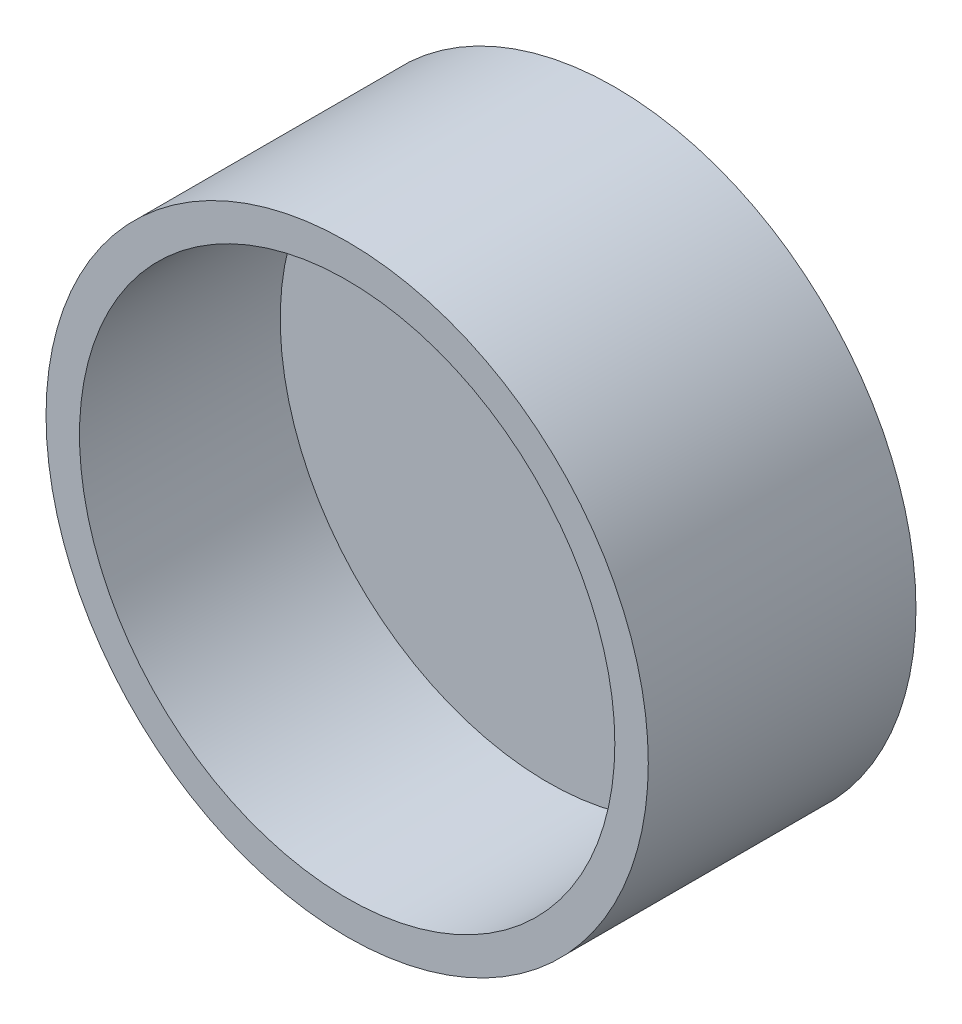
ISO-10303-21;
HEADER;
FILE_DESCRIPTION(('STEP AP214'),'2;1');
FILE_NAME('part.step','',(''),(''),'','','');
FILE_SCHEMA(('AUTOMOTIVE_DESIGN { 1 0 10303 214 1 1 1 1 }'));
ENDSEC;
DATA;
#1=APPLICATION_CONTEXT('core data for automotive mechanical design processes');
#2=APPLICATION_PROTOCOL_DEFINITION('international standard','automotive_design',2000,#1);
#3=PRODUCT_CONTEXT('',#1,'mechanical');
#4=PRODUCT('Part','Part','',(#3));
#5=PRODUCT_RELATED_PRODUCT_CATEGORY('part','',(#4));
#6=PRODUCT_DEFINITION_FORMATION('','',#4);
#7=PRODUCT_DEFINITION_CONTEXT('part definition',#1,'design');
#8=PRODUCT_DEFINITION('design','',#6,#7);
#9=PRODUCT_DEFINITION_SHAPE('','',#8);
#10=(LENGTH_UNIT() NAMED_UNIT(*) SI_UNIT(.MILLI.,.METRE.));
#11=(NAMED_UNIT(*) PLANE_ANGLE_UNIT() SI_UNIT($,.RADIAN.));
#12=(NAMED_UNIT(*) SI_UNIT($,.STERADIAN.) SOLID_ANGLE_UNIT());
#13=UNCERTAINTY_MEASURE_WITH_UNIT(LENGTH_MEASURE(1.E-05),#10,'distance_accuracy_value','');
#14=(GEOMETRIC_REPRESENTATION_CONTEXT(3) GLOBAL_UNCERTAINTY_ASSIGNED_CONTEXT((#13)) GLOBAL_UNIT_ASSIGNED_CONTEXT((#10,
#11,#12)) REPRESENTATION_CONTEXT('',''));
#15=CARTESIAN_POINT('',(0.,0.,0.));
#16=DIRECTION('',(0.,0.,1.));
#17=DIRECTION('',(1.,0.,0.));
#18=AXIS2_PLACEMENT_3D('',#15,#16,#17);
#19=CARTESIAN_POINT('',(0.,0.,20.));
#20=DIRECTION('',(0.,0.,-1.));
#21=DIRECTION('',(-1.,0.,0.));
#22=AXIS2_PLACEMENT_3D('',#19,#20,#21);
#23=CYLINDRICAL_SURFACE('',#22,22.5);
#24=CARTESIAN_POINT('',(0.,0.,20.));
#25=DIRECTION('',(0.,0.,1.));
#26=DIRECTION('',(1.,0.,0.));
#27=AXIS2_PLACEMENT_3D('',#24,#25,#26);
#28=CIRCLE('',#27,22.5);
#29=CARTESIAN_POINT('',(22.5,0.,20.));
#30=VERTEX_POINT('',#29);
#31=EDGE_CURVE('E10',#30,#30,#28,.T.);
#32=ORIENTED_EDGE('',*,*,#31,.F.);
#33=EDGE_LOOP('',(#32));
#34=FACE_BOUND('',#33,.T.);
#35=CARTESIAN_POINT('',(0.,0.,0.));
#36=DIRECTION('',(0.,0.,1.));
#37=DIRECTION('',(1.,0.,0.));
#38=AXIS2_PLACEMENT_3D('',#35,#36,#37);
#39=CIRCLE('',#38,22.5);
#40=CARTESIAN_POINT('',(22.5,0.,0.));
#41=VERTEX_POINT('',#40);
#42=EDGE_CURVE('E40',#41,#41,#39,.T.);
#43=ORIENTED_EDGE('',*,*,#42,.T.);
#44=EDGE_LOOP('',(#43));
#45=FACE_BOUND('',#44,.T.);
#46=ADVANCED_FACE('F37',(#34,#45),#23,.T.);
#47=CARTESIAN_POINT('',(0.,0.,20.));
#48=DIRECTION('',(0.,0.,1.));
#49=DIRECTION('',(1.,0.,0.));
#50=AXIS2_PLACEMENT_3D('',#47,#48,#49);
#51=PLANE('',#50);
#52=CARTESIAN_POINT('',(0.,0.,20.));
#53=DIRECTION('',(0.,0.,1.));
#54=DIRECTION('',(1.,0.,0.));
#55=AXIS2_PLACEMENT_3D('',#52,#53,#54);
#56=CIRCLE('',#55,20.);
#57=CARTESIAN_POINT('',(20.,0.,20.));
#58=VERTEX_POINT('',#57);
#59=EDGE_CURVE('E51',#58,#58,#56,.T.);
#60=ORIENTED_EDGE('',*,*,#59,.F.);
#61=EDGE_LOOP('',(#60));
#62=FACE_BOUND('',#61,.T.);
#63=ORIENTED_EDGE('',*,*,#31,.T.);
#64=EDGE_LOOP('',(#63));
#65=FACE_BOUND('',#64,.T.);
#66=ADVANCED_FACE('F68',(#62,#65),#51,.T.);
#67=CARTESIAN_POINT('',(0.,0.,0.));
#68=DIRECTION('',(0.,0.,1.));
#69=DIRECTION('',(1.,0.,0.));
#70=AXIS2_PLACEMENT_3D('',#67,#68,#69);
#71=PLANE('',#70);
#72=ORIENTED_EDGE('',*,*,#42,.F.);
#73=EDGE_LOOP('',(#72));
#74=FACE_BOUND('',#73,.T.);
#75=ADVANCED_FACE('F64',(#74),#71,.F.);
#76=CARTESIAN_POINT('',(0.,0.,5.));
#77=DIRECTION('',(0.,0.,1.));
#78=DIRECTION('',(1.,0.,0.));
#79=AXIS2_PLACEMENT_3D('',#76,#77,#78);
#80=CYLINDRICAL_SURFACE('',#79,20.);
#81=CARTESIAN_POINT('',(0.,0.,5.));
#82=DIRECTION('',(0.,0.,1.));
#83=DIRECTION('',(1.,0.,0.));
#84=AXIS2_PLACEMENT_3D('',#81,#82,#83);
#85=CIRCLE('',#84,20.);
#86=CARTESIAN_POINT('',(20.,0.,5.));
#87=VERTEX_POINT('',#86);
#88=EDGE_CURVE('E49',#87,#87,#85,.T.);
#89=ORIENTED_EDGE('',*,*,#88,.F.);
#90=EDGE_LOOP('',(#89));
#91=FACE_BOUND('',#90,.T.);
#92=ORIENTED_EDGE('',*,*,#59,.T.);
#93=EDGE_LOOP('',(#92));
#94=FACE_BOUND('',#93,.T.);
#95=ADVANCED_FACE('F61',(#91,#94),#80,.F.);
#96=CARTESIAN_POINT('',(0.,0.,5.));
#97=DIRECTION('',(0.,0.,1.));
#98=DIRECTION('',(1.,0.,0.));
#99=AXIS2_PLACEMENT_3D('',#96,#97,#98);
#100=PLANE('',#99);
#101=ORIENTED_EDGE('',*,*,#88,.T.);
#102=EDGE_LOOP('',(#101));
#103=FACE_BOUND('',#102,.T.);
#104=ADVANCED_FACE('F59',(#103),#100,.T.);
#105=CLOSED_SHELL('',(#46,#66,#75,#95,#104));
#106=MANIFOLD_SOLID_BREP('B2',#105);
#107=ADVANCED_BREP_SHAPE_REPRESENTATION('',(#18,#106),#14);
#108=SHAPE_DEFINITION_REPRESENTATION(#9,#107);
ENDSEC;
END-ISO-10303-21;
